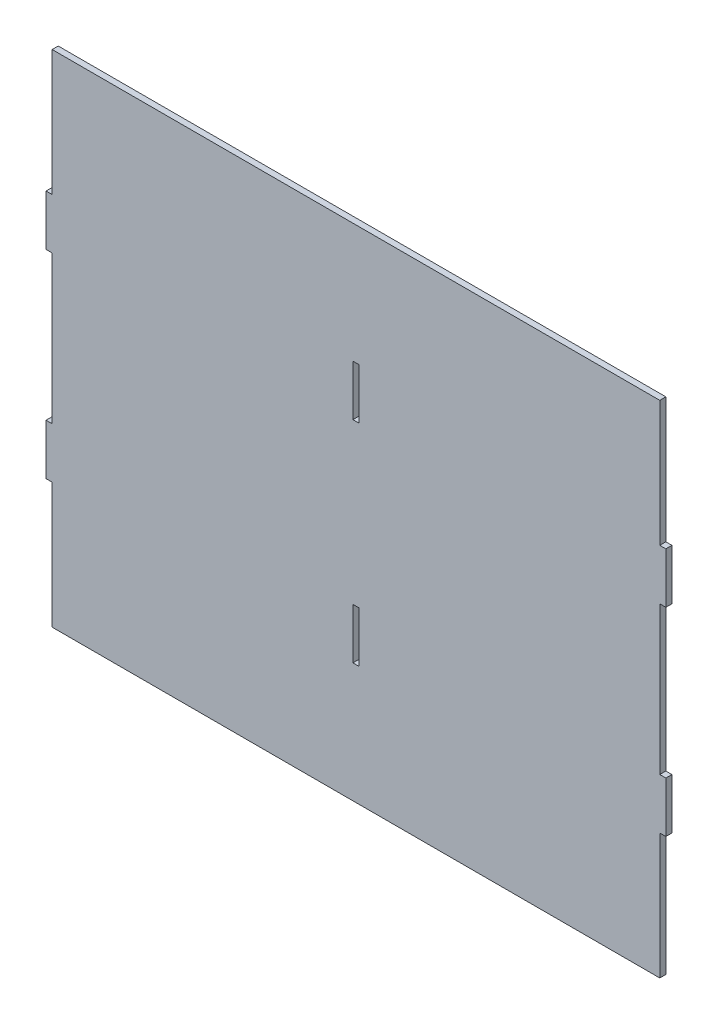
ISO-10303-21;
HEADER;
FILE_DESCRIPTION(('STEP AP214'),'2;1');
FILE_NAME('part.step','',(''),(''),'','','');
FILE_SCHEMA(('AUTOMOTIVE_DESIGN { 1 0 10303 214 1 1 1 1 }'));
ENDSEC;
DATA;
#1=APPLICATION_CONTEXT('core data for automotive mechanical design processes');
#2=APPLICATION_PROTOCOL_DEFINITION('international standard','automotive_design',2000,#1);
#3=PRODUCT_CONTEXT('',#1,'mechanical');
#4=PRODUCT('Part','Part','',(#3));
#5=PRODUCT_RELATED_PRODUCT_CATEGORY('part','',(#4));
#6=PRODUCT_DEFINITION_FORMATION('','',#4);
#7=PRODUCT_DEFINITION_CONTEXT('part definition',#1,'design');
#8=PRODUCT_DEFINITION('design','',#6,#7);
#9=PRODUCT_DEFINITION_SHAPE('','',#8);
#10=(LENGTH_UNIT() NAMED_UNIT(*) SI_UNIT(.MILLI.,.METRE.));
#11=(NAMED_UNIT(*) PLANE_ANGLE_UNIT() SI_UNIT($,.RADIAN.));
#12=(NAMED_UNIT(*) SI_UNIT($,.STERADIAN.) SOLID_ANGLE_UNIT());
#13=UNCERTAINTY_MEASURE_WITH_UNIT(LENGTH_MEASURE(1.E-05),#10,'distance_accuracy_value','');
#14=(GEOMETRIC_REPRESENTATION_CONTEXT(3) GLOBAL_UNCERTAINTY_ASSIGNED_CONTEXT((#13)) GLOBAL_UNIT_ASSIGNED_CONTEXT((#10,
#11,#12)) REPRESENTATION_CONTEXT('',''));
#15=CARTESIAN_POINT('',(0.,0.,0.));
#16=DIRECTION('',(0.,0.,1.));
#17=DIRECTION('',(1.,0.,0.));
#18=AXIS2_PLACEMENT_3D('',#15,#16,#17);
#19=CARTESIAN_POINT('',(0.,0.,6.));
#20=DIRECTION('',(0.,0.,-1.));
#21=DIRECTION('',(-1.,0.,0.));
#22=AXIS2_PLACEMENT_3D('',#19,#20,#21);
#23=PLANE('',#22);
#24=DIRECTION('',(0.,1.,0.));
#25=VECTOR('',#24,1.);
#26=CARTESIAN_POINT('',(3.00000000000019,129.,6.));
#27=LINE('',#26,#25);
#28=CARTESIAN_POINT('',(3.0000000000002,79.,6.));
#29=VERTEX_POINT('',#28);
#30=CARTESIAN_POINT('',(3.00000000000019,129.,6.));
#31=VERTEX_POINT('',#30);
#32=EDGE_CURVE('E254',#29,#31,#27,.T.);
#33=ORIENTED_EDGE('',*,*,#32,.F.);
#34=DIRECTION('',(1.,0.,0.));
#35=VECTOR('',#34,1.);
#36=CARTESIAN_POINT('',(-2.9999999999998,79.,6.));
#37=LINE('',#36,#35);
#38=CARTESIAN_POINT('',(-2.9999999999998,79.,6.));
#39=VERTEX_POINT('',#38);
#40=EDGE_CURVE('E262',#39,#29,#37,.T.);
#41=ORIENTED_EDGE('',*,*,#40,.F.);
#42=DIRECTION('',(0.,-1.,0.));
#43=VECTOR('',#42,1.);
#44=CARTESIAN_POINT('',(-2.99999999999981,129.,6.));
#45=LINE('',#44,#43);
#46=CARTESIAN_POINT('',(-2.99999999999981,129.,6.));
#47=VERTEX_POINT('',#46);
#48=EDGE_CURVE('E259',#47,#39,#45,.T.);
#49=ORIENTED_EDGE('',*,*,#48,.F.);
#50=DIRECTION('',(-1.,0.,0.));
#51=VECTOR('',#50,1.);
#52=CARTESIAN_POINT('',(-2.99999999999981,129.,6.));
#53=LINE('',#52,#51);
#54=EDGE_CURVE('E256',#31,#47,#53,.T.);
#55=ORIENTED_EDGE('',*,*,#54,.F.);
#56=EDGE_LOOP('',(#33,#41,#49,#55));
#57=FACE_BOUND('',#56,.T.);
#58=DIRECTION('',(0.,1.,0.));
#59=VECTOR('',#58,1.);
#60=CARTESIAN_POINT('',(300.,-247.,6.));
#61=LINE('',#60,#59);
#62=CARTESIAN_POINT('',(300.,-247.,6.));
#63=VERTEX_POINT('',#62);
#64=CARTESIAN_POINT('',(300.,-123.,6.));
#65=VERTEX_POINT('',#64);
#66=EDGE_CURVE('E285',#63,#65,#61,.T.);
#67=ORIENTED_EDGE('',*,*,#66,.T.);
#68=DIRECTION('',(1.,0.,0.));
#69=VECTOR('',#68,1.);
#70=CARTESIAN_POINT('',(300.,-123.,6.));
#71=LINE('',#70,#69);
#72=CARTESIAN_POINT('',(306.,-123.,6.));
#73=VERTEX_POINT('',#72);
#74=EDGE_CURVE('E288',#65,#73,#71,.T.);
#75=ORIENTED_EDGE('',*,*,#74,.T.);
#76=DIRECTION('',(0.,1.,0.));
#77=VECTOR('',#76,1.);
#78=CARTESIAN_POINT('',(306.,-72.9999999999999,6.));
#79=LINE('',#78,#77);
#80=CARTESIAN_POINT('',(306.,-72.9999999999999,6.));
#81=VERTEX_POINT('',#80);
#82=EDGE_CURVE('E291',#73,#81,#79,.T.);
#83=ORIENTED_EDGE('',*,*,#82,.T.);
#84=DIRECTION('',(-1.,0.,0.));
#85=VECTOR('',#84,1.);
#86=CARTESIAN_POINT('',(300.,-72.9999999999999,6.));
#87=LINE('',#86,#85);
#88=CARTESIAN_POINT('',(300.,-72.9999999999999,6.));
#89=VERTEX_POINT('',#88);
#90=EDGE_CURVE('E293',#81,#89,#87,.T.);
#91=ORIENTED_EDGE('',*,*,#90,.T.);
#92=DIRECTION('',(0.,1.,0.));
#93=VECTOR('',#92,1.);
#94=CARTESIAN_POINT('',(300.,73.0000000000001,6.));
#95=LINE('',#94,#93);
#96=CARTESIAN_POINT('',(300.,73.0000000000001,6.));
#97=VERTEX_POINT('',#96);
#98=EDGE_CURVE('E295',#89,#97,#95,.T.);
#99=ORIENTED_EDGE('',*,*,#98,.T.);
#100=DIRECTION('',(1.,0.,0.));
#101=VECTOR('',#100,1.);
#102=CARTESIAN_POINT('',(305.999999999999,73.0000000000001,6.));
#103=LINE('',#102,#101);
#104=CARTESIAN_POINT('',(305.999999999999,73.0000000000001,6.));
#105=VERTEX_POINT('',#104);
#106=EDGE_CURVE('E297',#97,#105,#103,.T.);
#107=ORIENTED_EDGE('',*,*,#106,.T.);
#108=DIRECTION('',(0.,1.,0.));
#109=VECTOR('',#108,1.);
#110=CARTESIAN_POINT('',(305.999999999999,123.,6.));
#111=LINE('',#110,#109);
#112=CARTESIAN_POINT('',(305.999999999999,123.,6.));
#113=VERTEX_POINT('',#112);
#114=EDGE_CURVE('E299',#105,#113,#111,.T.);
#115=ORIENTED_EDGE('',*,*,#114,.T.);
#116=DIRECTION('',(-1.,0.,0.));
#117=VECTOR('',#116,1.);
#118=CARTESIAN_POINT('',(305.999999999999,123.,6.));
#119=LINE('',#118,#117);
#120=CARTESIAN_POINT('',(300.,123.,6.));
#121=VERTEX_POINT('',#120);
#122=EDGE_CURVE('E301',#113,#121,#119,.T.);
#123=ORIENTED_EDGE('',*,*,#122,.T.);
#124=DIRECTION('',(0.,1.,0.));
#125=VECTOR('',#124,1.);
#126=CARTESIAN_POINT('',(300.,247.,6.));
#127=LINE('',#126,#125);
#128=CARTESIAN_POINT('',(300.,247.,6.));
#129=VERTEX_POINT('',#128);
#130=EDGE_CURVE('E303',#121,#129,#127,.T.);
#131=ORIENTED_EDGE('',*,*,#130,.T.);
#132=DIRECTION('',(-1.,0.,0.));
#133=VECTOR('',#132,1.);
#134=CARTESIAN_POINT('',(-300.,247.,6.));
#135=LINE('',#134,#133);
#136=CARTESIAN_POINT('',(-300.,247.,6.));
#137=VERTEX_POINT('',#136);
#138=EDGE_CURVE('E305',#129,#137,#135,.T.);
#139=ORIENTED_EDGE('',*,*,#138,.T.);
#140=DIRECTION('',(0.,-1.,0.));
#141=VECTOR('',#140,1.);
#142=CARTESIAN_POINT('',(-300.,247.,6.));
#143=LINE('',#142,#141);
#144=CARTESIAN_POINT('',(-300.,123.,6.));
#145=VERTEX_POINT('',#144);
#146=EDGE_CURVE('E307',#137,#145,#143,.T.);
#147=ORIENTED_EDGE('',*,*,#146,.T.);
#148=DIRECTION('',(-1.,0.,0.));
#149=VECTOR('',#148,1.);
#150=CARTESIAN_POINT('',(-305.999999999999,123.,6.));
#151=LINE('',#150,#149);
#152=CARTESIAN_POINT('',(-305.999999999999,123.,6.));
#153=VERTEX_POINT('',#152);
#154=EDGE_CURVE('E309',#145,#153,#151,.T.);
#155=ORIENTED_EDGE('',*,*,#154,.T.);
#156=DIRECTION('',(0.,-1.,0.));
#157=VECTOR('',#156,1.);
#158=CARTESIAN_POINT('',(-305.999999999999,123.,6.));
#159=LINE('',#158,#157);
#160=CARTESIAN_POINT('',(-305.999999999999,73.,6.));
#161=VERTEX_POINT('',#160);
#162=EDGE_CURVE('E311',#153,#161,#159,.T.);
#163=ORIENTED_EDGE('',*,*,#162,.T.);
#164=DIRECTION('',(1.,0.,0.));
#165=VECTOR('',#164,1.);
#166=CARTESIAN_POINT('',(-305.999999999999,73.,6.));
#167=LINE('',#166,#165);
#168=CARTESIAN_POINT('',(-300.,73.,6.));
#169=VERTEX_POINT('',#168);
#170=EDGE_CURVE('E313',#161,#169,#167,.T.);
#171=ORIENTED_EDGE('',*,*,#170,.T.);
#172=DIRECTION('',(0.,-1.,0.));
#173=VECTOR('',#172,1.);
#174=CARTESIAN_POINT('',(-300.,73.,6.));
#175=LINE('',#174,#173);
#176=CARTESIAN_POINT('',(-300.,-73.,6.));
#177=VERTEX_POINT('',#176);
#178=EDGE_CURVE('E315',#169,#177,#175,.T.);
#179=ORIENTED_EDGE('',*,*,#178,.T.);
#180=DIRECTION('',(-1.,0.,0.));
#181=VECTOR('',#180,1.);
#182=CARTESIAN_POINT('',(-306.,-73.,6.));
#183=LINE('',#182,#181);
#184=CARTESIAN_POINT('',(-306.,-73.,6.));
#185=VERTEX_POINT('',#184);
#186=EDGE_CURVE('E317',#177,#185,#183,.T.);
#187=ORIENTED_EDGE('',*,*,#186,.T.);
#188=DIRECTION('',(0.,-1.,0.));
#189=VECTOR('',#188,1.);
#190=CARTESIAN_POINT('',(-306.,-123.,6.));
#191=LINE('',#190,#189);
#192=CARTESIAN_POINT('',(-306.,-123.,6.));
#193=VERTEX_POINT('',#192);
#194=EDGE_CURVE('E319',#185,#193,#191,.T.);
#195=ORIENTED_EDGE('',*,*,#194,.T.);
#196=DIRECTION('',(1.,0.,0.));
#197=VECTOR('',#196,1.);
#198=CARTESIAN_POINT('',(-306.,-123.,6.));
#199=LINE('',#198,#197);
#200=CARTESIAN_POINT('',(-300.,-123.,6.));
#201=VERTEX_POINT('',#200);
#202=EDGE_CURVE('E321',#193,#201,#199,.T.);
#203=ORIENTED_EDGE('',*,*,#202,.T.);
#204=DIRECTION('',(0.,-1.,0.));
#205=VECTOR('',#204,1.);
#206=CARTESIAN_POINT('',(-300.,-123.,6.));
#207=LINE('',#206,#205);
#208=CARTESIAN_POINT('',(-300.,-247.,6.));
#209=VERTEX_POINT('',#208);
#210=EDGE_CURVE('E323',#201,#209,#207,.T.);
#211=ORIENTED_EDGE('',*,*,#210,.T.);
#212=DIRECTION('',(1.,0.,0.));
#213=VECTOR('',#212,1.);
#214=CARTESIAN_POINT('',(-300.,-247.,6.));
#215=LINE('',#214,#213);
#216=EDGE_CURVE('E325',#209,#63,#215,.T.);
#217=ORIENTED_EDGE('',*,*,#216,.T.);
#218=EDGE_LOOP('',(#67,#75,#83,#91,#99,#107,#115,#123,#131,#139,#147,#155,#163,#171,#179,#187,
#195,#203,#211,#217));
#219=FACE_BOUND('',#218,.T.);
#220=DIRECTION('',(0.,-1.,0.));
#221=VECTOR('',#220,1.);
#222=CARTESIAN_POINT('',(-2.99999999999977,-129.,6.));
#223=LINE('',#222,#221);
#224=CARTESIAN_POINT('',(-2.99999999999978,-79.,6.));
#225=VERTEX_POINT('',#224);
#226=CARTESIAN_POINT('',(-2.99999999999977,-129.,6.));
#227=VERTEX_POINT('',#226);
#228=EDGE_CURVE('E218',#225,#227,#223,.T.);
#229=ORIENTED_EDGE('',*,*,#228,.F.);
#230=DIRECTION('',(-1.,0.,0.));
#231=VECTOR('',#230,1.);
#232=CARTESIAN_POINT('',(-2.99999999999978,-79.,6.));
#233=LINE('',#232,#231);
#234=CARTESIAN_POINT('',(3.00000000000022,-79.,6.));
#235=VERTEX_POINT('',#234);
#236=EDGE_CURVE('E240',#235,#225,#233,.T.);
#237=ORIENTED_EDGE('',*,*,#236,.F.);
#238=DIRECTION('',(0.,1.,0.));
#239=VECTOR('',#238,1.);
#240=CARTESIAN_POINT('',(3.00000000000023,-129.,6.));
#241=LINE('',#240,#239);
#242=CARTESIAN_POINT('',(3.00000000000023,-129.,6.));
#243=VERTEX_POINT('',#242);
#244=EDGE_CURVE('E238',#243,#235,#241,.T.);
#245=ORIENTED_EDGE('',*,*,#244,.F.);
#246=DIRECTION('',(1.,0.,0.));
#247=VECTOR('',#246,1.);
#248=CARTESIAN_POINT('',(-2.99999999999977,-129.,6.));
#249=LINE('',#248,#247);
#250=EDGE_CURVE('E226',#227,#243,#249,.T.);
#251=ORIENTED_EDGE('',*,*,#250,.F.);
#252=EDGE_LOOP('',(#229,#237,#245,#251));
#253=FACE_BOUND('',#252,.T.);
#254=ADVANCED_FACE('F33',(#57,#219,#253),#23,.F.);
#255=CARTESIAN_POINT('',(0.,0.,0.));
#256=DIRECTION('',(0.,0.,-1.));
#257=DIRECTION('',(-1.,0.,0.));
#258=AXIS2_PLACEMENT_3D('',#255,#256,#257);
#259=PLANE('',#258);
#260=DIRECTION('',(0.,1.,0.));
#261=VECTOR('',#260,1.);
#262=CARTESIAN_POINT('',(300.,-247.,0.));
#263=LINE('',#262,#261);
#264=CARTESIAN_POINT('',(300.,-247.,0.));
#265=VERTEX_POINT('',#264);
#266=CARTESIAN_POINT('',(300.,-123.,0.));
#267=VERTEX_POINT('',#266);
#268=EDGE_CURVE('E284',#265,#267,#263,.T.);
#269=ORIENTED_EDGE('',*,*,#268,.F.);
#270=DIRECTION('',(1.,0.,0.));
#271=VECTOR('',#270,1.);
#272=CARTESIAN_POINT('',(-300.,-247.,0.));
#273=LINE('',#272,#271);
#274=CARTESIAN_POINT('',(-300.,-247.,0.));
#275=VERTEX_POINT('',#274);
#276=EDGE_CURVE('E289',#275,#265,#273,.T.);
#277=ORIENTED_EDGE('',*,*,#276,.F.);
#278=DIRECTION('',(0.,-1.,0.));
#279=VECTOR('',#278,1.);
#280=CARTESIAN_POINT('',(-300.,-123.,0.));
#281=LINE('',#280,#279);
#282=CARTESIAN_POINT('',(-300.,-123.,0.));
#283=VERTEX_POINT('',#282);
#284=EDGE_CURVE('E364',#283,#275,#281,.T.);
#285=ORIENTED_EDGE('',*,*,#284,.F.);
#286=DIRECTION('',(1.,0.,0.));
#287=VECTOR('',#286,1.);
#288=CARTESIAN_POINT('',(-306.,-123.,0.));
#289=LINE('',#288,#287);
#290=CARTESIAN_POINT('',(-306.,-123.,0.));
#291=VERTEX_POINT('',#290);
#292=EDGE_CURVE('E362',#291,#283,#289,.T.);
#293=ORIENTED_EDGE('',*,*,#292,.F.);
#294=DIRECTION('',(0.,-1.,0.));
#295=VECTOR('',#294,1.);
#296=CARTESIAN_POINT('',(-306.,-123.,0.));
#297=LINE('',#296,#295);
#298=CARTESIAN_POINT('',(-306.,-73.,0.));
#299=VERTEX_POINT('',#298);
#300=EDGE_CURVE('E360',#299,#291,#297,.T.);
#301=ORIENTED_EDGE('',*,*,#300,.F.);
#302=DIRECTION('',(-1.,0.,0.));
#303=VECTOR('',#302,1.);
#304=CARTESIAN_POINT('',(-306.,-73.,0.));
#305=LINE('',#304,#303);
#306=CARTESIAN_POINT('',(-300.,-73.,0.));
#307=VERTEX_POINT('',#306);
#308=EDGE_CURVE('E358',#307,#299,#305,.T.);
#309=ORIENTED_EDGE('',*,*,#308,.F.);
#310=DIRECTION('',(0.,-1.,0.));
#311=VECTOR('',#310,1.);
#312=CARTESIAN_POINT('',(-300.,73.,0.));
#313=LINE('',#312,#311);
#314=CARTESIAN_POINT('',(-300.,73.,0.));
#315=VERTEX_POINT('',#314);
#316=EDGE_CURVE('E356',#315,#307,#313,.T.);
#317=ORIENTED_EDGE('',*,*,#316,.F.);
#318=DIRECTION('',(1.,0.,0.));
#319=VECTOR('',#318,1.);
#320=CARTESIAN_POINT('',(-305.999999999999,73.,0.));
#321=LINE('',#320,#319);
#322=CARTESIAN_POINT('',(-305.999999999999,73.,0.));
#323=VERTEX_POINT('',#322);
#324=EDGE_CURVE('E354',#323,#315,#321,.T.);
#325=ORIENTED_EDGE('',*,*,#324,.F.);
#326=DIRECTION('',(0.,-1.,0.));
#327=VECTOR('',#326,1.);
#328=CARTESIAN_POINT('',(-305.999999999999,123.,0.));
#329=LINE('',#328,#327);
#330=CARTESIAN_POINT('',(-305.999999999999,123.,0.));
#331=VERTEX_POINT('',#330);
#332=EDGE_CURVE('E352',#331,#323,#329,.T.);
#333=ORIENTED_EDGE('',*,*,#332,.F.);
#334=DIRECTION('',(-1.,0.,0.));
#335=VECTOR('',#334,1.);
#336=CARTESIAN_POINT('',(-305.999999999999,123.,0.));
#337=LINE('',#336,#335);
#338=CARTESIAN_POINT('',(-300.,123.,0.));
#339=VERTEX_POINT('',#338);
#340=EDGE_CURVE('E350',#339,#331,#337,.T.);
#341=ORIENTED_EDGE('',*,*,#340,.F.);
#342=DIRECTION('',(0.,-1.,0.));
#343=VECTOR('',#342,1.);
#344=CARTESIAN_POINT('',(-300.,247.,0.));
#345=LINE('',#344,#343);
#346=CARTESIAN_POINT('',(-300.,247.,0.));
#347=VERTEX_POINT('',#346);
#348=EDGE_CURVE('E348',#347,#339,#345,.T.);
#349=ORIENTED_EDGE('',*,*,#348,.F.);
#350=DIRECTION('',(-1.,0.,0.));
#351=VECTOR('',#350,1.);
#352=CARTESIAN_POINT('',(-300.,247.,0.));
#353=LINE('',#352,#351);
#354=CARTESIAN_POINT('',(300.,247.,0.));
#355=VERTEX_POINT('',#354);
#356=EDGE_CURVE('E346',#355,#347,#353,.T.);
#357=ORIENTED_EDGE('',*,*,#356,.F.);
#358=DIRECTION('',(0.,1.,0.));
#359=VECTOR('',#358,1.);
#360=CARTESIAN_POINT('',(300.,247.,0.));
#361=LINE('',#360,#359);
#362=CARTESIAN_POINT('',(300.,123.,0.));
#363=VERTEX_POINT('',#362);
#364=EDGE_CURVE('E344',#363,#355,#361,.T.);
#365=ORIENTED_EDGE('',*,*,#364,.F.);
#366=DIRECTION('',(-1.,0.,0.));
#367=VECTOR('',#366,1.);
#368=CARTESIAN_POINT('',(305.999999999999,123.,0.));
#369=LINE('',#368,#367);
#370=CARTESIAN_POINT('',(305.999999999999,123.,0.));
#371=VERTEX_POINT('',#370);
#372=EDGE_CURVE('E342',#371,#363,#369,.T.);
#373=ORIENTED_EDGE('',*,*,#372,.F.);
#374=DIRECTION('',(0.,1.,0.));
#375=VECTOR('',#374,1.);
#376=CARTESIAN_POINT('',(305.999999999999,123.,0.));
#377=LINE('',#376,#375);
#378=CARTESIAN_POINT('',(305.999999999999,73.0000000000001,0.));
#379=VERTEX_POINT('',#378);
#380=EDGE_CURVE('E340',#379,#371,#377,.T.);
#381=ORIENTED_EDGE('',*,*,#380,.F.);
#382=DIRECTION('',(1.,0.,0.));
#383=VECTOR('',#382,1.);
#384=CARTESIAN_POINT('',(305.999999999999,73.0000000000001,0.));
#385=LINE('',#384,#383);
#386=CARTESIAN_POINT('',(300.,73.0000000000001,0.));
#387=VERTEX_POINT('',#386);
#388=EDGE_CURVE('E338',#387,#379,#385,.T.);
#389=ORIENTED_EDGE('',*,*,#388,.F.);
#390=DIRECTION('',(0.,1.,0.));
#391=VECTOR('',#390,1.);
#392=CARTESIAN_POINT('',(300.,73.0000000000001,0.));
#393=LINE('',#392,#391);
#394=CARTESIAN_POINT('',(300.,-72.9999999999999,0.));
#395=VERTEX_POINT('',#394);
#396=EDGE_CURVE('E336',#395,#387,#393,.T.);
#397=ORIENTED_EDGE('',*,*,#396,.F.);
#398=DIRECTION('',(-1.,0.,0.));
#399=VECTOR('',#398,1.);
#400=CARTESIAN_POINT('',(300.,-72.9999999999999,0.));
#401=LINE('',#400,#399);
#402=CARTESIAN_POINT('',(306.,-72.9999999999999,0.));
#403=VERTEX_POINT('',#402);
#404=EDGE_CURVE('E334',#403,#395,#401,.T.);
#405=ORIENTED_EDGE('',*,*,#404,.F.);
#406=DIRECTION('',(0.,1.,0.));
#407=VECTOR('',#406,1.);
#408=CARTESIAN_POINT('',(306.,-72.9999999999999,0.));
#409=LINE('',#408,#407);
#410=CARTESIAN_POINT('',(306.,-123.,0.));
#411=VERTEX_POINT('',#410);
#412=EDGE_CURVE('E332',#411,#403,#409,.T.);
#413=ORIENTED_EDGE('',*,*,#412,.F.);
#414=DIRECTION('',(1.,0.,0.));
#415=VECTOR('',#414,1.);
#416=CARTESIAN_POINT('',(300.,-123.,0.));
#417=LINE('',#416,#415);
#418=EDGE_CURVE('E330',#267,#411,#417,.T.);
#419=ORIENTED_EDGE('',*,*,#418,.F.);
#420=EDGE_LOOP('',(#269,#277,#285,#293,#301,#309,#317,#325,#333,#341,#349,#357,#365,#373,#381,
#389,#397,#405,#413,#419));
#421=FACE_BOUND('',#420,.T.);
#422=DIRECTION('',(1.,0.,0.));
#423=VECTOR('',#422,1.);
#424=CARTESIAN_POINT('',(-2.9999999999998,79.,0.));
#425=LINE('',#424,#423);
#426=CARTESIAN_POINT('',(-2.9999999999998,79.,0.));
#427=VERTEX_POINT('',#426);
#428=CARTESIAN_POINT('',(3.0000000000002,79.,0.));
#429=VERTEX_POINT('',#428);
#430=EDGE_CURVE('E257',#427,#429,#425,.T.);
#431=ORIENTED_EDGE('',*,*,#430,.T.);
#432=DIRECTION('',(0.,1.,0.));
#433=VECTOR('',#432,1.);
#434=CARTESIAN_POINT('',(3.00000000000019,129.,0.));
#435=LINE('',#434,#433);
#436=CARTESIAN_POINT('',(3.00000000000019,129.,0.));
#437=VERTEX_POINT('',#436);
#438=EDGE_CURVE('E234',#429,#437,#435,.T.);
#439=ORIENTED_EDGE('',*,*,#438,.T.);
#440=DIRECTION('',(-1.,0.,0.));
#441=VECTOR('',#440,1.);
#442=CARTESIAN_POINT('',(-2.99999999999981,129.,0.));
#443=LINE('',#442,#441);
#444=CARTESIAN_POINT('',(-2.99999999999981,129.,0.));
#445=VERTEX_POINT('',#444);
#446=EDGE_CURVE('E267',#437,#445,#443,.T.);
#447=ORIENTED_EDGE('',*,*,#446,.T.);
#448=DIRECTION('',(0.,-1.,0.));
#449=VECTOR('',#448,1.);
#450=CARTESIAN_POINT('',(-2.99999999999981,129.,0.));
#451=LINE('',#450,#449);
#452=EDGE_CURVE('E270',#445,#427,#451,.T.);
#453=ORIENTED_EDGE('',*,*,#452,.T.);
#454=EDGE_LOOP('',(#431,#439,#447,#453));
#455=FACE_BOUND('',#454,.T.);
#456=DIRECTION('',(-1.,0.,0.));
#457=VECTOR('',#456,1.);
#458=CARTESIAN_POINT('',(-2.99999999999978,-79.,0.));
#459=LINE('',#458,#457);
#460=CARTESIAN_POINT('',(3.00000000000022,-79.,0.));
#461=VERTEX_POINT('',#460);
#462=CARTESIAN_POINT('',(-2.99999999999978,-79.,0.));
#463=VERTEX_POINT('',#462);
#464=EDGE_CURVE('E227',#461,#463,#459,.T.);
#465=ORIENTED_EDGE('',*,*,#464,.T.);
#466=DIRECTION('',(0.,-1.,0.));
#467=VECTOR('',#466,1.);
#468=CARTESIAN_POINT('',(-2.99999999999977,-129.,0.));
#469=LINE('',#468,#467);
#470=CARTESIAN_POINT('',(-2.99999999999977,-129.,0.));
#471=VERTEX_POINT('',#470);
#472=EDGE_CURVE('E56',#463,#471,#469,.T.);
#473=ORIENTED_EDGE('',*,*,#472,.T.);
#474=DIRECTION('',(1.,0.,0.));
#475=VECTOR('',#474,1.);
#476=CARTESIAN_POINT('',(-2.99999999999977,-129.,0.));
#477=LINE('',#476,#475);
#478=CARTESIAN_POINT('',(3.00000000000023,-129.,0.));
#479=VERTEX_POINT('',#478);
#480=EDGE_CURVE('E233',#471,#479,#477,.T.);
#481=ORIENTED_EDGE('',*,*,#480,.T.);
#482=DIRECTION('',(0.,1.,0.));
#483=VECTOR('',#482,1.);
#484=CARTESIAN_POINT('',(3.00000000000023,-129.,0.));
#485=LINE('',#484,#483);
#486=EDGE_CURVE('E246',#479,#461,#485,.T.);
#487=ORIENTED_EDGE('',*,*,#486,.T.);
#488=EDGE_LOOP('',(#465,#473,#481,#487));
#489=FACE_BOUND('',#488,.T.);
#490=ADVANCED_FACE('F430',(#421,#455,#489),#259,.T.);
#491=CARTESIAN_POINT('',(300.,-247.,6.));
#492=DIRECTION('',(-1.,0.,0.));
#493=DIRECTION('',(0.,-1.,0.));
#494=AXIS2_PLACEMENT_3D('',#491,#492,#493);
#495=PLANE('',#494);
#496=ORIENTED_EDGE('',*,*,#268,.T.);
#497=DIRECTION('',(0.,0.,-1.));
#498=VECTOR('',#497,1.);
#499=CARTESIAN_POINT('',(300.,-123.,6.));
#500=LINE('',#499,#498);
#501=EDGE_CURVE('E11',#65,#267,#500,.T.);
#502=ORIENTED_EDGE('',*,*,#501,.F.);
#503=ORIENTED_EDGE('',*,*,#66,.F.);
#504=DIRECTION('',(0.,0.,-1.));
#505=VECTOR('',#504,1.);
#506=CARTESIAN_POINT('',(300.,-247.,6.));
#507=LINE('',#506,#505);
#508=EDGE_CURVE('E327',#63,#265,#507,.T.);
#509=ORIENTED_EDGE('',*,*,#508,.T.);
#510=EDGE_LOOP('',(#496,#502,#503,#509));
#511=FACE_BOUND('',#510,.T.);
#512=ADVANCED_FACE('F35',(#511),#495,.F.);
#513=CARTESIAN_POINT('',(300.,-123.,6.));
#514=DIRECTION('',(0.,1.,0.));
#515=DIRECTION('',(0.,0.,1.));
#516=AXIS2_PLACEMENT_3D('',#513,#514,#515);
#517=PLANE('',#516);
#518=ORIENTED_EDGE('',*,*,#418,.T.);
#519=DIRECTION('',(0.,0.,-1.));
#520=VECTOR('',#519,1.);
#521=CARTESIAN_POINT('',(306.,-123.,6.));
#522=LINE('',#521,#520);
#523=EDGE_CURVE('E41',#73,#411,#522,.T.);
#524=ORIENTED_EDGE('',*,*,#523,.F.);
#525=ORIENTED_EDGE('',*,*,#74,.F.);
#526=ORIENTED_EDGE('',*,*,#501,.T.);
#527=EDGE_LOOP('',(#518,#524,#525,#526));
#528=FACE_BOUND('',#527,.T.);
#529=ADVANCED_FACE('F447',(#528),#517,.F.);
#530=CARTESIAN_POINT('',(306.,-72.9999999999999,6.));
#531=DIRECTION('',(-1.,0.,0.));
#532=DIRECTION('',(0.,-1.,0.));
#533=AXIS2_PLACEMENT_3D('',#530,#531,#532);
#534=PLANE('',#533);
#535=ORIENTED_EDGE('',*,*,#412,.T.);
#536=DIRECTION('',(0.,0.,-1.));
#537=VECTOR('',#536,1.);
#538=CARTESIAN_POINT('',(306.,-72.9999999999999,6.));
#539=LINE('',#538,#537);
#540=EDGE_CURVE('E417',#81,#403,#539,.T.);
#541=ORIENTED_EDGE('',*,*,#540,.F.);
#542=ORIENTED_EDGE('',*,*,#82,.F.);
#543=ORIENTED_EDGE('',*,*,#523,.T.);
#544=EDGE_LOOP('',(#535,#541,#542,#543));
#545=FACE_BOUND('',#544,.T.);
#546=ADVANCED_FACE('F424',(#545),#534,.F.);
#547=CARTESIAN_POINT('',(300.,-72.9999999999999,6.));
#548=DIRECTION('',(0.,-1.,0.));
#549=DIRECTION('',(0.,0.,-1.));
#550=AXIS2_PLACEMENT_3D('',#547,#548,#549);
#551=PLANE('',#550);
#552=ORIENTED_EDGE('',*,*,#404,.T.);
#553=DIRECTION('',(0.,0.,-1.));
#554=VECTOR('',#553,1.);
#555=CARTESIAN_POINT('',(300.,-72.9999999999999,6.));
#556=LINE('',#555,#554);
#557=EDGE_CURVE('E414',#89,#395,#556,.T.);
#558=ORIENTED_EDGE('',*,*,#557,.F.);
#559=ORIENTED_EDGE('',*,*,#90,.F.);
#560=ORIENTED_EDGE('',*,*,#540,.T.);
#561=EDGE_LOOP('',(#552,#558,#559,#560));
#562=FACE_BOUND('',#561,.T.);
#563=ADVANCED_FACE('F436',(#562),#551,.F.);
#564=CARTESIAN_POINT('',(300.,73.0000000000001,6.));
#565=DIRECTION('',(-1.,0.,0.));
#566=DIRECTION('',(0.,0.,1.));
#567=AXIS2_PLACEMENT_3D('',#564,#565,#566);
#568=PLANE('',#567);
#569=ORIENTED_EDGE('',*,*,#396,.T.);
#570=DIRECTION('',(0.,0.,-1.));
#571=VECTOR('',#570,1.);
#572=CARTESIAN_POINT('',(300.,73.0000000000001,6.));
#573=LINE('',#572,#571);
#574=EDGE_CURVE('E411',#97,#387,#573,.T.);
#575=ORIENTED_EDGE('',*,*,#574,.F.);
#576=ORIENTED_EDGE('',*,*,#98,.F.);
#577=ORIENTED_EDGE('',*,*,#557,.T.);
#578=EDGE_LOOP('',(#569,#575,#576,#577));
#579=FACE_BOUND('',#578,.T.);
#580=ADVANCED_FACE('F440',(#579),#568,.F.);
#581=CARTESIAN_POINT('',(305.999999999999,73.0000000000001,6.));
#582=DIRECTION('',(0.,1.,0.));
#583=DIRECTION('',(0.,0.,1.));
#584=AXIS2_PLACEMENT_3D('',#581,#582,#583);
#585=PLANE('',#584);
#586=ORIENTED_EDGE('',*,*,#388,.T.);
#587=DIRECTION('',(0.,0.,-1.));
#588=VECTOR('',#587,1.);
#589=CARTESIAN_POINT('',(305.999999999999,73.0000000000001,6.));
#590=LINE('',#589,#588);
#591=EDGE_CURVE('E408',#105,#379,#590,.T.);
#592=ORIENTED_EDGE('',*,*,#591,.F.);
#593=ORIENTED_EDGE('',*,*,#106,.F.);
#594=ORIENTED_EDGE('',*,*,#574,.T.);
#595=EDGE_LOOP('',(#586,#592,#593,#594));
#596=FACE_BOUND('',#595,.T.);
#597=ADVANCED_FACE('F520',(#596),#585,.F.);
#598=CARTESIAN_POINT('',(305.999999999999,123.,6.));
#599=DIRECTION('',(-1.,0.,0.));
#600=DIRECTION('',(0.,0.,1.));
#601=AXIS2_PLACEMENT_3D('',#598,#599,#600);
#602=PLANE('',#601);
#603=ORIENTED_EDGE('',*,*,#380,.T.);
#604=DIRECTION('',(0.,0.,-1.));
#605=VECTOR('',#604,1.);
#606=CARTESIAN_POINT('',(305.999999999999,123.,6.));
#607=LINE('',#606,#605);
#608=EDGE_CURVE('E405',#113,#371,#607,.T.);
#609=ORIENTED_EDGE('',*,*,#608,.F.);
#610=ORIENTED_EDGE('',*,*,#114,.F.);
#611=ORIENTED_EDGE('',*,*,#591,.T.);
#612=EDGE_LOOP('',(#603,#609,#610,#611));
#613=FACE_BOUND('',#612,.T.);
#614=ADVANCED_FACE('F518',(#613),#602,.F.);
#615=CARTESIAN_POINT('',(305.999999999999,123.,6.));
#616=DIRECTION('',(0.,-1.,0.));
#617=DIRECTION('',(0.,0.,-1.));
#618=AXIS2_PLACEMENT_3D('',#615,#616,#617);
#619=PLANE('',#618);
#620=ORIENTED_EDGE('',*,*,#372,.T.);
#621=DIRECTION('',(0.,0.,-1.));
#622=VECTOR('',#621,1.);
#623=CARTESIAN_POINT('',(300.,123.,6.));
#624=LINE('',#623,#622);
#625=EDGE_CURVE('E402',#121,#363,#624,.T.);
#626=ORIENTED_EDGE('',*,*,#625,.F.);
#627=ORIENTED_EDGE('',*,*,#122,.F.);
#628=ORIENTED_EDGE('',*,*,#608,.T.);
#629=EDGE_LOOP('',(#620,#626,#627,#628));
#630=FACE_BOUND('',#629,.T.);
#631=ADVANCED_FACE('F513',(#630),#619,.F.);
#632=CARTESIAN_POINT('',(300.,247.,6.));
#633=DIRECTION('',(-1.,0.,0.));
#634=DIRECTION('',(0.,-1.,0.));
#635=AXIS2_PLACEMENT_3D('',#632,#633,#634);
#636=PLANE('',#635);
#637=ORIENTED_EDGE('',*,*,#364,.T.);
#638=DIRECTION('',(0.,0.,-1.));
#639=VECTOR('',#638,1.);
#640=CARTESIAN_POINT('',(300.,247.,6.));
#641=LINE('',#640,#639);
#642=EDGE_CURVE('E399',#129,#355,#641,.T.);
#643=ORIENTED_EDGE('',*,*,#642,.F.);
#644=ORIENTED_EDGE('',*,*,#130,.F.);
#645=ORIENTED_EDGE('',*,*,#625,.T.);
#646=EDGE_LOOP('',(#637,#643,#644,#645));
#647=FACE_BOUND('',#646,.T.);
#648=ADVANCED_FACE('F508',(#647),#636,.F.);
#649=CARTESIAN_POINT('',(-300.,247.,6.));
#650=DIRECTION('',(0.,-1.,0.));
#651=DIRECTION('',(1.,0.,0.));
#652=AXIS2_PLACEMENT_3D('',#649,#650,#651);
#653=PLANE('',#652);
#654=ORIENTED_EDGE('',*,*,#356,.T.);
#655=DIRECTION('',(0.,0.,-1.));
#656=VECTOR('',#655,1.);
#657=CARTESIAN_POINT('',(-300.,247.,6.));
#658=LINE('',#657,#656);
#659=EDGE_CURVE('E396',#137,#347,#658,.T.);
#660=ORIENTED_EDGE('',*,*,#659,.F.);
#661=ORIENTED_EDGE('',*,*,#138,.F.);
#662=ORIENTED_EDGE('',*,*,#642,.T.);
#663=EDGE_LOOP('',(#654,#660,#661,#662));
#664=FACE_BOUND('',#663,.T.);
#665=ADVANCED_FACE('F504',(#664),#653,.F.);
#666=CARTESIAN_POINT('',(-300.,247.,6.));
#667=DIRECTION('',(1.,0.,0.));
#668=DIRECTION('',(0.,1.,0.));
#669=AXIS2_PLACEMENT_3D('',#666,#667,#668);
#670=PLANE('',#669);
#671=ORIENTED_EDGE('',*,*,#348,.T.);
#672=DIRECTION('',(0.,0.,-1.));
#673=VECTOR('',#672,1.);
#674=CARTESIAN_POINT('',(-300.,123.,6.));
#675=LINE('',#674,#673);
#676=EDGE_CURVE('E393',#145,#339,#675,.T.);
#677=ORIENTED_EDGE('',*,*,#676,.F.);
#678=ORIENTED_EDGE('',*,*,#146,.F.);
#679=ORIENTED_EDGE('',*,*,#659,.T.);
#680=EDGE_LOOP('',(#671,#677,#678,#679));
#681=FACE_BOUND('',#680,.T.);
#682=ADVANCED_FACE('F499',(#681),#670,.F.);
#683=CARTESIAN_POINT('',(-305.999999999999,123.,6.));
#684=DIRECTION('',(0.,-1.,0.));
#685=DIRECTION('',(0.,0.,-1.));
#686=AXIS2_PLACEMENT_3D('',#683,#684,#685);
#687=PLANE('',#686);
#688=ORIENTED_EDGE('',*,*,#340,.T.);
#689=DIRECTION('',(0.,0.,-1.));
#690=VECTOR('',#689,1.);
#691=CARTESIAN_POINT('',(-305.999999999999,123.,6.));
#692=LINE('',#691,#690);
#693=EDGE_CURVE('E390',#153,#331,#692,.T.);
#694=ORIENTED_EDGE('',*,*,#693,.F.);
#695=ORIENTED_EDGE('',*,*,#154,.F.);
#696=ORIENTED_EDGE('',*,*,#676,.T.);
#697=EDGE_LOOP('',(#688,#694,#695,#696));
#698=FACE_BOUND('',#697,.T.);
#699=ADVANCED_FACE('F493',(#698),#687,.F.);
#700=CARTESIAN_POINT('',(-305.999999999999,123.,6.));
#701=DIRECTION('',(1.,0.,0.));
#702=DIRECTION('',(0.,0.,-1.));
#703=AXIS2_PLACEMENT_3D('',#700,#701,#702);
#704=PLANE('',#703);
#705=ORIENTED_EDGE('',*,*,#332,.T.);
#706=DIRECTION('',(0.,0.,-1.));
#707=VECTOR('',#706,1.);
#708=CARTESIAN_POINT('',(-305.999999999999,73.,6.));
#709=LINE('',#708,#707);
#710=EDGE_CURVE('E387',#161,#323,#709,.T.);
#711=ORIENTED_EDGE('',*,*,#710,.F.);
#712=ORIENTED_EDGE('',*,*,#162,.F.);
#713=ORIENTED_EDGE('',*,*,#693,.T.);
#714=EDGE_LOOP('',(#705,#711,#712,#713));
#715=FACE_BOUND('',#714,.T.);
#716=ADVANCED_FACE('F489',(#715),#704,.F.);
#717=CARTESIAN_POINT('',(-305.999999999999,73.,6.));
#718=DIRECTION('',(0.,1.,0.));
#719=DIRECTION('',(0.,0.,1.));
#720=AXIS2_PLACEMENT_3D('',#717,#718,#719);
#721=PLANE('',#720);
#722=ORIENTED_EDGE('',*,*,#324,.T.);
#723=DIRECTION('',(0.,0.,-1.));
#724=VECTOR('',#723,1.);
#725=CARTESIAN_POINT('',(-300.,73.,6.));
#726=LINE('',#725,#724);
#727=EDGE_CURVE('E384',#169,#315,#726,.T.);
#728=ORIENTED_EDGE('',*,*,#727,.F.);
#729=ORIENTED_EDGE('',*,*,#170,.F.);
#730=ORIENTED_EDGE('',*,*,#710,.T.);
#731=EDGE_LOOP('',(#722,#728,#729,#730));
#732=FACE_BOUND('',#731,.T.);
#733=ADVANCED_FACE('F484',(#732),#721,.F.);
#734=CARTESIAN_POINT('',(-300.,73.,6.));
#735=DIRECTION('',(1.,0.,0.));
#736=DIRECTION('',(0.,0.,-1.));
#737=AXIS2_PLACEMENT_3D('',#734,#735,#736);
#738=PLANE('',#737);
#739=ORIENTED_EDGE('',*,*,#316,.T.);
#740=DIRECTION('',(0.,0.,-1.));
#741=VECTOR('',#740,1.);
#742=CARTESIAN_POINT('',(-300.,-73.,6.));
#743=LINE('',#742,#741);
#744=EDGE_CURVE('E381',#177,#307,#743,.T.);
#745=ORIENTED_EDGE('',*,*,#744,.F.);
#746=ORIENTED_EDGE('',*,*,#178,.F.);
#747=ORIENTED_EDGE('',*,*,#727,.T.);
#748=EDGE_LOOP('',(#739,#745,#746,#747));
#749=FACE_BOUND('',#748,.T.);
#750=ADVANCED_FACE('F478',(#749),#738,.F.);
#751=CARTESIAN_POINT('',(-306.,-73.,6.));
#752=DIRECTION('',(0.,-1.,0.));
#753=DIRECTION('',(0.,0.,-1.));
#754=AXIS2_PLACEMENT_3D('',#751,#752,#753);
#755=PLANE('',#754);
#756=ORIENTED_EDGE('',*,*,#308,.T.);
#757=DIRECTION('',(0.,0.,-1.));
#758=VECTOR('',#757,1.);
#759=CARTESIAN_POINT('',(-306.,-73.,6.));
#760=LINE('',#759,#758);
#761=EDGE_CURVE('E378',#185,#299,#760,.T.);
#762=ORIENTED_EDGE('',*,*,#761,.F.);
#763=ORIENTED_EDGE('',*,*,#186,.F.);
#764=ORIENTED_EDGE('',*,*,#744,.T.);
#765=EDGE_LOOP('',(#756,#762,#763,#764));
#766=FACE_BOUND('',#765,.T.);
#767=ADVANCED_FACE('F474',(#766),#755,.F.);
#768=CARTESIAN_POINT('',(-306.,-123.,6.));
#769=DIRECTION('',(1.,0.,0.));
#770=DIRECTION('',(0.,0.,-1.));
#771=AXIS2_PLACEMENT_3D('',#768,#769,#770);
#772=PLANE('',#771);
#773=ORIENTED_EDGE('',*,*,#300,.T.);
#774=DIRECTION('',(0.,0.,-1.));
#775=VECTOR('',#774,1.);
#776=CARTESIAN_POINT('',(-306.,-123.,6.));
#777=LINE('',#776,#775);
#778=EDGE_CURVE('E375',#193,#291,#777,.T.);
#779=ORIENTED_EDGE('',*,*,#778,.F.);
#780=ORIENTED_EDGE('',*,*,#194,.F.);
#781=ORIENTED_EDGE('',*,*,#761,.T.);
#782=EDGE_LOOP('',(#773,#779,#780,#781));
#783=FACE_BOUND('',#782,.T.);
#784=ADVANCED_FACE('F469',(#783),#772,.F.);
#785=CARTESIAN_POINT('',(-306.,-123.,6.));
#786=DIRECTION('',(0.,1.,0.));
#787=DIRECTION('',(0.,0.,1.));
#788=AXIS2_PLACEMENT_3D('',#785,#786,#787);
#789=PLANE('',#788);
#790=ORIENTED_EDGE('',*,*,#292,.T.);
#791=DIRECTION('',(0.,0.,-1.));
#792=VECTOR('',#791,1.);
#793=CARTESIAN_POINT('',(-300.,-123.,6.));
#794=LINE('',#793,#792);
#795=EDGE_CURVE('E372',#201,#283,#794,.T.);
#796=ORIENTED_EDGE('',*,*,#795,.F.);
#797=ORIENTED_EDGE('',*,*,#202,.F.);
#798=ORIENTED_EDGE('',*,*,#778,.T.);
#799=EDGE_LOOP('',(#790,#796,#797,#798));
#800=FACE_BOUND('',#799,.T.);
#801=ADVANCED_FACE('F463',(#800),#789,.F.);
#802=CARTESIAN_POINT('',(-300.,-123.,6.));
#803=DIRECTION('',(1.,0.,0.));
#804=DIRECTION('',(0.,1.,0.));
#805=AXIS2_PLACEMENT_3D('',#802,#803,#804);
#806=PLANE('',#805);
#807=ORIENTED_EDGE('',*,*,#284,.T.);
#808=DIRECTION('',(0.,0.,-1.));
#809=VECTOR('',#808,1.);
#810=CARTESIAN_POINT('',(-300.,-247.,6.));
#811=LINE('',#810,#809);
#812=EDGE_CURVE('E369',#209,#275,#811,.T.);
#813=ORIENTED_EDGE('',*,*,#812,.F.);
#814=ORIENTED_EDGE('',*,*,#210,.F.);
#815=ORIENTED_EDGE('',*,*,#795,.T.);
#816=EDGE_LOOP('',(#807,#813,#814,#815));
#817=FACE_BOUND('',#816,.T.);
#818=ADVANCED_FACE('F459',(#817),#806,.F.);
#819=CARTESIAN_POINT('',(-300.,-247.,6.));
#820=DIRECTION('',(0.,1.,0.));
#821=DIRECTION('',(-1.,0.,0.));
#822=AXIS2_PLACEMENT_3D('',#819,#820,#821);
#823=PLANE('',#822);
#824=ORIENTED_EDGE('',*,*,#276,.T.);
#825=ORIENTED_EDGE('',*,*,#508,.F.);
#826=ORIENTED_EDGE('',*,*,#216,.F.);
#827=ORIENTED_EDGE('',*,*,#812,.T.);
#828=EDGE_LOOP('',(#824,#825,#826,#827));
#829=FACE_BOUND('',#828,.T.);
#830=ADVANCED_FACE('F454',(#829),#823,.F.);
#831=CARTESIAN_POINT('',(3.00000000000019,129.,6.));
#832=DIRECTION('',(-1.,0.,0.));
#833=DIRECTION('',(0.,-1.,0.));
#834=AXIS2_PLACEMENT_3D('',#831,#832,#833);
#835=PLANE('',#834);
#836=ORIENTED_EDGE('',*,*,#438,.F.);
#837=DIRECTION('',(0.,0.,-1.));
#838=VECTOR('',#837,1.);
#839=CARTESIAN_POINT('',(3.0000000000002,79.,6.));
#840=LINE('',#839,#838);
#841=EDGE_CURVE('E264',#29,#429,#840,.T.);
#842=ORIENTED_EDGE('',*,*,#841,.F.);
#843=ORIENTED_EDGE('',*,*,#32,.T.);
#844=DIRECTION('',(0.,0.,-1.));
#845=VECTOR('',#844,1.);
#846=CARTESIAN_POINT('',(3.00000000000019,129.,6.));
#847=LINE('',#846,#845);
#848=EDGE_CURVE('E281',#31,#437,#847,.T.);
#849=ORIENTED_EDGE('',*,*,#848,.T.);
#850=EDGE_LOOP('',(#836,#842,#843,#849));
#851=FACE_BOUND('',#850,.T.);
#852=ADVANCED_FACE('F538',(#851),#835,.T.);
#853=CARTESIAN_POINT('',(-2.99999999999981,129.,6.));
#854=DIRECTION('',(0.,-1.,0.));
#855=DIRECTION('',(0.,0.,-1.));
#856=AXIS2_PLACEMENT_3D('',#853,#854,#855);
#857=PLANE('',#856);
#858=ORIENTED_EDGE('',*,*,#446,.F.);
#859=ORIENTED_EDGE('',*,*,#848,.F.);
#860=ORIENTED_EDGE('',*,*,#54,.T.);
#861=DIRECTION('',(0.,0.,-1.));
#862=VECTOR('',#861,1.);
#863=CARTESIAN_POINT('',(-2.99999999999981,129.,6.));
#864=LINE('',#863,#862);
#865=EDGE_CURVE('E279',#47,#445,#864,.T.);
#866=ORIENTED_EDGE('',*,*,#865,.T.);
#867=EDGE_LOOP('',(#858,#859,#860,#866));
#868=FACE_BOUND('',#867,.T.);
#869=ADVANCED_FACE('F624',(#868),#857,.T.);
#870=CARTESIAN_POINT('',(-2.99999999999981,129.,6.));
#871=DIRECTION('',(1.,0.,0.));
#872=DIRECTION('',(0.,1.,0.));
#873=AXIS2_PLACEMENT_3D('',#870,#871,#872);
#874=PLANE('',#873);
#875=ORIENTED_EDGE('',*,*,#452,.F.);
#876=ORIENTED_EDGE('',*,*,#865,.F.);
#877=ORIENTED_EDGE('',*,*,#48,.T.);
#878=DIRECTION('',(0.,0.,-1.));
#879=VECTOR('',#878,1.);
#880=CARTESIAN_POINT('',(-2.9999999999998,79.,6.));
#881=LINE('',#880,#879);
#882=EDGE_CURVE('E277',#39,#427,#881,.T.);
#883=ORIENTED_EDGE('',*,*,#882,.T.);
#884=EDGE_LOOP('',(#875,#876,#877,#883));
#885=FACE_BOUND('',#884,.T.);
#886=ADVANCED_FACE('F631',(#885),#874,.T.);
#887=CARTESIAN_POINT('',(-2.9999999999998,79.,6.));
#888=DIRECTION('',(0.,1.,0.));
#889=DIRECTION('',(0.,0.,1.));
#890=AXIS2_PLACEMENT_3D('',#887,#888,#889);
#891=PLANE('',#890);
#892=ORIENTED_EDGE('',*,*,#430,.F.);
#893=ORIENTED_EDGE('',*,*,#882,.F.);
#894=ORIENTED_EDGE('',*,*,#40,.T.);
#895=ORIENTED_EDGE('',*,*,#841,.T.);
#896=EDGE_LOOP('',(#892,#893,#894,#895));
#897=FACE_BOUND('',#896,.T.);
#898=ADVANCED_FACE('F638',(#897),#891,.T.);
#899=CARTESIAN_POINT('',(-2.99999999999977,-129.,6.));
#900=DIRECTION('',(1.,0.,0.));
#901=DIRECTION('',(0.,1.,0.));
#902=AXIS2_PLACEMENT_3D('',#899,#900,#901);
#903=PLANE('',#902);
#904=ORIENTED_EDGE('',*,*,#472,.F.);
#905=DIRECTION('',(0.,0.,-1.));
#906=VECTOR('',#905,1.);
#907=CARTESIAN_POINT('',(-2.99999999999978,-79.,6.));
#908=LINE('',#907,#906);
#909=EDGE_CURVE('E222',#225,#463,#908,.T.);
#910=ORIENTED_EDGE('',*,*,#909,.F.);
#911=ORIENTED_EDGE('',*,*,#228,.T.);
#912=DIRECTION('',(0.,0.,-1.));
#913=VECTOR('',#912,1.);
#914=CARTESIAN_POINT('',(-2.99999999999977,-129.,6.));
#915=LINE('',#914,#913);
#916=EDGE_CURVE('E221',#227,#471,#915,.T.);
#917=ORIENTED_EDGE('',*,*,#916,.T.);
#918=EDGE_LOOP('',(#904,#910,#911,#917));
#919=FACE_BOUND('',#918,.T.);
#920=ADVANCED_FACE('F220',(#919),#903,.T.);
#921=CARTESIAN_POINT('',(-2.99999999999977,-129.,6.));
#922=DIRECTION('',(0.,1.,0.));
#923=DIRECTION('',(0.,0.,1.));
#924=AXIS2_PLACEMENT_3D('',#921,#922,#923);
#925=PLANE('',#924);
#926=ORIENTED_EDGE('',*,*,#480,.F.);
#927=ORIENTED_EDGE('',*,*,#916,.F.);
#928=ORIENTED_EDGE('',*,*,#250,.T.);
#929=DIRECTION('',(0.,0.,-1.));
#930=VECTOR('',#929,1.);
#931=CARTESIAN_POINT('',(3.00000000000023,-129.,6.));
#932=LINE('',#931,#930);
#933=EDGE_CURVE('E235',#243,#479,#932,.T.);
#934=ORIENTED_EDGE('',*,*,#933,.T.);
#935=EDGE_LOOP('',(#926,#927,#928,#934));
#936=FACE_BOUND('',#935,.T.);
#937=ADVANCED_FACE('F230',(#936),#925,.T.);
#938=CARTESIAN_POINT('',(3.00000000000023,-129.,6.));
#939=DIRECTION('',(-1.,0.,0.));
#940=DIRECTION('',(0.,-1.,0.));
#941=AXIS2_PLACEMENT_3D('',#938,#939,#940);
#942=PLANE('',#941);
#943=ORIENTED_EDGE('',*,*,#486,.F.);
#944=ORIENTED_EDGE('',*,*,#933,.F.);
#945=ORIENTED_EDGE('',*,*,#244,.T.);
#946=DIRECTION('',(0.,0.,-1.));
#947=VECTOR('',#946,1.);
#948=CARTESIAN_POINT('',(3.00000000000022,-79.,6.));
#949=LINE('',#948,#947);
#950=EDGE_CURVE('E48',#235,#461,#949,.T.);
#951=ORIENTED_EDGE('',*,*,#950,.T.);
#952=EDGE_LOOP('',(#943,#944,#945,#951));
#953=FACE_BOUND('',#952,.T.);
#954=ADVANCED_FACE('F659',(#953),#942,.T.);
#955=CARTESIAN_POINT('',(-2.99999999999978,-79.,6.));
#956=DIRECTION('',(0.,-1.,0.));
#957=DIRECTION('',(0.,0.,-1.));
#958=AXIS2_PLACEMENT_3D('',#955,#956,#957);
#959=PLANE('',#958);
#960=ORIENTED_EDGE('',*,*,#464,.F.);
#961=ORIENTED_EDGE('',*,*,#950,.F.);
#962=ORIENTED_EDGE('',*,*,#236,.T.);
#963=ORIENTED_EDGE('',*,*,#909,.T.);
#964=EDGE_LOOP('',(#960,#961,#962,#963));
#965=FACE_BOUND('',#964,.T.);
#966=ADVANCED_FACE('F666',(#965),#959,.T.);
#967=CLOSED_SHELL('',(#254,#490,#512,#529,#546,#563,#580,#597,#614,#631,#648,#665,#682,#699,
#716,#733,#750,#767,#784,#801,#818,#830,#852,#869,#886,#898,#920,#937,#954,#966));
#968=MANIFOLD_SOLID_BREP('B2',#967);
#969=ADVANCED_BREP_SHAPE_REPRESENTATION('',(#18,#968),#14);
#970=SHAPE_DEFINITION_REPRESENTATION(#9,#969);
ENDSEC;
END-ISO-10303-21;
